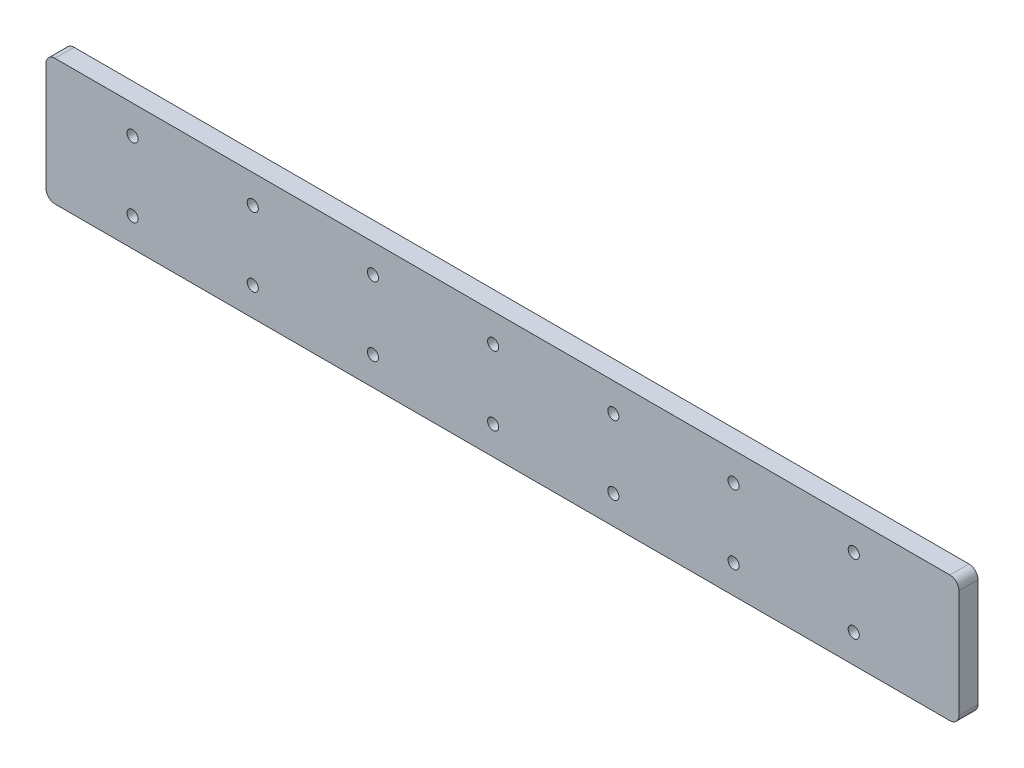
ISO-10303-21;
HEADER;
FILE_DESCRIPTION(('STEP AP214'),'2;1');
FILE_NAME('part.step','',(''),(''),'','','');
FILE_SCHEMA(('AUTOMOTIVE_DESIGN { 1 0 10303 214 1 1 1 1 }'));
ENDSEC;
DATA;
#1=APPLICATION_CONTEXT('core data for automotive mechanical design processes');
#2=APPLICATION_PROTOCOL_DEFINITION('international standard','automotive_design',2000,#1);
#3=PRODUCT_CONTEXT('',#1,'mechanical');
#4=PRODUCT('Part','Part','',(#3));
#5=PRODUCT_RELATED_PRODUCT_CATEGORY('part','',(#4));
#6=PRODUCT_DEFINITION_FORMATION('','',#4);
#7=PRODUCT_DEFINITION_CONTEXT('part definition',#1,'design');
#8=PRODUCT_DEFINITION('design','',#6,#7);
#9=PRODUCT_DEFINITION_SHAPE('','',#8);
#10=(LENGTH_UNIT() NAMED_UNIT(*) SI_UNIT(.MILLI.,.METRE.));
#11=(NAMED_UNIT(*) PLANE_ANGLE_UNIT() SI_UNIT($,.RADIAN.));
#12=(NAMED_UNIT(*) SI_UNIT($,.STERADIAN.) SOLID_ANGLE_UNIT());
#13=UNCERTAINTY_MEASURE_WITH_UNIT(LENGTH_MEASURE(1.E-05),#10,'distance_accuracy_value','');
#14=(GEOMETRIC_REPRESENTATION_CONTEXT(3) GLOBAL_UNCERTAINTY_ASSIGNED_CONTEXT((#13)) GLOBAL_UNIT_ASSIGNED_CONTEXT((#10,
#11,#12)) REPRESENTATION_CONTEXT('',''));
#15=CARTESIAN_POINT('',(0.,0.,0.));
#16=DIRECTION('',(0.,0.,1.));
#17=DIRECTION('',(1.,0.,0.));
#18=AXIS2_PLACEMENT_3D('',#15,#16,#17);
#19=CARTESIAN_POINT('',(0.,0.,6.35));
#20=DIRECTION('',(0.,0.,-1.));
#21=DIRECTION('',(-1.,0.,0.));
#22=AXIS2_PLACEMENT_3D('',#19,#20,#21);
#23=PLANE('',#22);
#24=CARTESIAN_POINT('',(-75.,-11.4999999999994,6.35));
#25=DIRECTION('',(0.,0.,1.));
#26=DIRECTION('',(-1.,0.,0.));
#27=AXIS2_PLACEMENT_3D('',#24,#25,#26);
#28=CIRCLE('',#27,1.84999999999999);
#29=CARTESIAN_POINT('',(-76.85,-11.4999999999994,6.35));
#30=VERTEX_POINT('',#29);
#31=EDGE_CURVE('E241',#30,#30,#28,.T.);
#32=ORIENTED_EDGE('',*,*,#31,.F.);
#33=EDGE_LOOP('',(#32));
#34=FACE_BOUND('',#33,.T.);
#35=CARTESIAN_POINT('',(-155.,-11.4999999999988,6.35));
#36=DIRECTION('',(0.,0.,1.));
#37=DIRECTION('',(-1.,0.,0.));
#38=AXIS2_PLACEMENT_3D('',#35,#36,#37);
#39=CIRCLE('',#38,1.85);
#40=CARTESIAN_POINT('',(-156.85,-11.4999999999988,6.35));
#41=VERTEX_POINT('',#40);
#42=EDGE_CURVE('E229',#41,#41,#39,.T.);
#43=ORIENTED_EDGE('',*,*,#42,.F.);
#44=EDGE_LOOP('',(#43));
#45=FACE_BOUND('',#44,.T.);
#46=CARTESIAN_POINT('',(-235.,-11.4999999999981,6.35));
#47=DIRECTION('',(0.,0.,1.));
#48=DIRECTION('',(-1.,0.,0.));
#49=AXIS2_PLACEMENT_3D('',#46,#47,#48);
#50=CIRCLE('',#49,1.85);
#51=CARTESIAN_POINT('',(-236.85,-11.4999999999981,6.35));
#52=VERTEX_POINT('',#51);
#53=EDGE_CURVE('E217',#52,#52,#50,.T.);
#54=ORIENTED_EDGE('',*,*,#53,.F.);
#55=EDGE_LOOP('',(#54));
#56=FACE_BOUND('',#55,.T.);
#57=CARTESIAN_POINT('',(-235.,11.4999999999983,6.35));
#58=DIRECTION('',(0.,0.,1.));
#59=DIRECTION('',(1.,0.,0.));
#60=AXIS2_PLACEMENT_3D('',#57,#58,#59);
#61=CIRCLE('',#60,1.85);
#62=CARTESIAN_POINT('',(-233.15,11.4999999999983,6.35));
#63=VERTEX_POINT('',#62);
#64=EDGE_CURVE('E205',#63,#63,#61,.T.);
#65=ORIENTED_EDGE('',*,*,#64,.F.);
#66=EDGE_LOOP('',(#65));
#67=FACE_BOUND('',#66,.T.);
#68=CARTESIAN_POINT('',(-155.,11.4999999999989,6.35));
#69=DIRECTION('',(0.,0.,1.));
#70=DIRECTION('',(1.,0.,0.));
#71=AXIS2_PLACEMENT_3D('',#68,#69,#70);
#72=CIRCLE('',#71,1.85);
#73=CARTESIAN_POINT('',(-153.15,11.4999999999989,6.35));
#74=VERTEX_POINT('',#73);
#75=EDGE_CURVE('E193',#74,#74,#72,.T.);
#76=ORIENTED_EDGE('',*,*,#75,.F.);
#77=EDGE_LOOP('',(#76));
#78=FACE_BOUND('',#77,.T.);
#79=CARTESIAN_POINT('',(-75.,11.4999999999994,6.35));
#80=DIRECTION('',(0.,0.,1.));
#81=DIRECTION('',(1.,0.,0.));
#82=AXIS2_PLACEMENT_3D('',#79,#80,#81);
#83=CIRCLE('',#82,1.84999999999999);
#84=CARTESIAN_POINT('',(-73.15,11.4999999999994,6.35));
#85=VERTEX_POINT('',#84);
#86=EDGE_CURVE('E181',#85,#85,#83,.T.);
#87=ORIENTED_EDGE('',*,*,#86,.F.);
#88=EDGE_LOOP('',(#87));
#89=FACE_BOUND('',#88,.T.);
#90=CARTESIAN_POINT('',(-275.,-11.4999999999978,6.35));
#91=DIRECTION('',(0.,0.,1.));
#92=DIRECTION('',(-1.,0.,0.));
#93=AXIS2_PLACEMENT_3D('',#90,#91,#92);
#94=CIRCLE('',#93,1.84999999999998);
#95=CARTESIAN_POINT('',(-276.85,-11.4999999999978,6.35));
#96=VERTEX_POINT('',#95);
#97=EDGE_CURVE('E164',#96,#96,#94,.T.);
#98=ORIENTED_EDGE('',*,*,#97,.F.);
#99=EDGE_LOOP('',(#98));
#100=FACE_BOUND('',#99,.T.);
#101=DIRECTION('',(0.,-1.,0.));
#102=VECTOR('',#101,1.);
#103=CARTESIAN_POINT('',(-303.8,21.,6.35));
#104=LINE('',#103,#102);
#105=CARTESIAN_POINT('',(-303.8,18.,6.35));
#106=VERTEX_POINT('',#105);
#107=CARTESIAN_POINT('',(-303.8,-18.,6.35));
#108=VERTEX_POINT('',#107);
#109=EDGE_CURVE('E171',#106,#108,#104,.T.);
#110=ORIENTED_EDGE('',*,*,#109,.T.);
#111=CARTESIAN_POINT('',(-300.8,-18.,6.35));
#112=DIRECTION('',(0.,0.,-1.));
#113=DIRECTION('',(-1.,0.,0.));
#114=AXIS2_PLACEMENT_3D('',#111,#112,#113);
#115=CIRCLE('',#114,3.);
#116=CARTESIAN_POINT('',(-300.8,-21.,6.35));
#117=VERTEX_POINT('',#116);
#118=EDGE_CURVE('E148',#108,#117,#115,.F.);
#119=ORIENTED_EDGE('',*,*,#118,.T.);
#120=DIRECTION('',(1.,0.,0.));
#121=VECTOR('',#120,1.);
#122=CARTESIAN_POINT('',(0.,-21.,6.35));
#123=LINE('',#122,#121);
#124=CARTESIAN_POINT('',(-2.99999999999999,-21.,6.35));
#125=VERTEX_POINT('',#124);
#126=EDGE_CURVE('E119',#117,#125,#123,.T.);
#127=ORIENTED_EDGE('',*,*,#126,.T.);
#128=CARTESIAN_POINT('',(-2.99999999999999,-18.,6.35));
#129=DIRECTION('',(0.,0.,-1.));
#130=DIRECTION('',(-1.,0.,0.));
#131=AXIS2_PLACEMENT_3D('',#128,#129,#130);
#132=CIRCLE('',#131,3.);
#133=CARTESIAN_POINT('',(0.,-18.,6.35));
#134=VERTEX_POINT('',#133);
#135=EDGE_CURVE('E146',#125,#134,#132,.F.);
#136=ORIENTED_EDGE('',*,*,#135,.T.);
#137=DIRECTION('',(0.,1.,0.));
#138=VECTOR('',#137,1.);
#139=CARTESIAN_POINT('',(0.,21.,6.35));
#140=LINE('',#139,#138);
#141=CARTESIAN_POINT('',(0.,18.,6.35));
#142=VERTEX_POINT('',#141);
#143=EDGE_CURVE('E126',#134,#142,#140,.T.);
#144=ORIENTED_EDGE('',*,*,#143,.T.);
#145=CARTESIAN_POINT('',(-2.99999999999999,18.,6.35));
#146=DIRECTION('',(0.,0.,-1.));
#147=DIRECTION('',(-1.,0.,0.));
#148=AXIS2_PLACEMENT_3D('',#145,#146,#147);
#149=CIRCLE('',#148,3.);
#150=CARTESIAN_POINT('',(-2.99999999999999,21.,6.35));
#151=VERTEX_POINT('',#150);
#152=EDGE_CURVE('E54',#142,#151,#149,.F.);
#153=ORIENTED_EDGE('',*,*,#152,.T.);
#154=DIRECTION('',(-1.,0.,0.));
#155=VECTOR('',#154,1.);
#156=CARTESIAN_POINT('',(0.,21.,6.35));
#157=LINE('',#156,#155);
#158=CARTESIAN_POINT('',(-300.8,21.,6.35));
#159=VERTEX_POINT('',#158);
#160=EDGE_CURVE('E129',#151,#159,#157,.T.);
#161=ORIENTED_EDGE('',*,*,#160,.T.);
#162=CARTESIAN_POINT('',(-300.8,18.,6.35));
#163=DIRECTION('',(0.,0.,-1.));
#164=DIRECTION('',(-1.,0.,0.));
#165=AXIS2_PLACEMENT_3D('',#162,#163,#164);
#166=CIRCLE('',#165,3.);
#167=EDGE_CURVE('E143',#159,#106,#166,.F.);
#168=ORIENTED_EDGE('',*,*,#167,.T.);
#169=EDGE_LOOP('',(#110,#119,#127,#136,#144,#153,#161,#168));
#170=FACE_BOUND('',#169,.T.);
#171=CARTESIAN_POINT('',(-35.,11.4999999999997,6.35));
#172=DIRECTION('',(0.,0.,1.));
#173=DIRECTION('',(1.,0.,0.));
#174=AXIS2_PLACEMENT_3D('',#171,#172,#173);
#175=CIRCLE('',#174,1.85);
#176=CARTESIAN_POINT('',(-33.15,11.4999999999997,6.35));
#177=VERTEX_POINT('',#176);
#178=EDGE_CURVE('E176',#177,#177,#175,.T.);
#179=ORIENTED_EDGE('',*,*,#178,.F.);
#180=EDGE_LOOP('',(#179));
#181=FACE_BOUND('',#180,.T.);
#182=CARTESIAN_POINT('',(-115.,11.4999999999992,6.35));
#183=DIRECTION('',(0.,0.,1.));
#184=DIRECTION('',(1.,0.,0.));
#185=AXIS2_PLACEMENT_3D('',#182,#183,#184);
#186=CIRCLE('',#185,1.84999999999999);
#187=CARTESIAN_POINT('',(-113.15,11.4999999999992,6.35));
#188=VERTEX_POINT('',#187);
#189=EDGE_CURVE('E187',#188,#188,#186,.T.);
#190=ORIENTED_EDGE('',*,*,#189,.F.);
#191=EDGE_LOOP('',(#190));
#192=FACE_BOUND('',#191,.T.);
#193=CARTESIAN_POINT('',(-195.,11.4999999999986,6.35));
#194=DIRECTION('',(0.,0.,1.));
#195=DIRECTION('',(1.,0.,0.));
#196=AXIS2_PLACEMENT_3D('',#193,#194,#195);
#197=CIRCLE('',#196,1.85);
#198=CARTESIAN_POINT('',(-193.15,11.4999999999986,6.35));
#199=VERTEX_POINT('',#198);
#200=EDGE_CURVE('E199',#199,#199,#197,.T.);
#201=ORIENTED_EDGE('',*,*,#200,.F.);
#202=EDGE_LOOP('',(#201));
#203=FACE_BOUND('',#202,.T.);
#204=CARTESIAN_POINT('',(-275.,11.499999999998,6.35));
#205=DIRECTION('',(0.,0.,1.));
#206=DIRECTION('',(1.,0.,0.));
#207=AXIS2_PLACEMENT_3D('',#204,#205,#206);
#208=CIRCLE('',#207,1.84999999999998);
#209=CARTESIAN_POINT('',(-273.15,11.499999999998,6.35));
#210=VERTEX_POINT('',#209);
#211=EDGE_CURVE('E211',#210,#210,#208,.T.);
#212=ORIENTED_EDGE('',*,*,#211,.F.);
#213=EDGE_LOOP('',(#212));
#214=FACE_BOUND('',#213,.T.);
#215=CARTESIAN_POINT('',(-195.,-11.4999999999985,6.35));
#216=DIRECTION('',(0.,0.,1.));
#217=DIRECTION('',(-1.,0.,0.));
#218=AXIS2_PLACEMENT_3D('',#215,#216,#217);
#219=CIRCLE('',#218,1.85);
#220=CARTESIAN_POINT('',(-196.85,-11.4999999999985,6.35));
#221=VERTEX_POINT('',#220);
#222=EDGE_CURVE('E223',#221,#221,#219,.T.);
#223=ORIENTED_EDGE('',*,*,#222,.F.);
#224=EDGE_LOOP('',(#223));
#225=FACE_BOUND('',#224,.T.);
#226=CARTESIAN_POINT('',(-115.,-11.4999999999991,6.35));
#227=DIRECTION('',(0.,0.,1.));
#228=DIRECTION('',(-1.,0.,0.));
#229=AXIS2_PLACEMENT_3D('',#226,#227,#228);
#230=CIRCLE('',#229,1.84999999999999);
#231=CARTESIAN_POINT('',(-116.85,-11.4999999999991,6.35));
#232=VERTEX_POINT('',#231);
#233=EDGE_CURVE('E235',#232,#232,#230,.T.);
#234=ORIENTED_EDGE('',*,*,#233,.F.);
#235=EDGE_LOOP('',(#234));
#236=FACE_BOUND('',#235,.T.);
#237=CARTESIAN_POINT('',(-35.,-11.4999999999997,6.35));
#238=DIRECTION('',(0.,0.,1.));
#239=DIRECTION('',(-1.,0.,0.));
#240=AXIS2_PLACEMENT_3D('',#237,#238,#239);
#241=CIRCLE('',#240,1.85);
#242=CARTESIAN_POINT('',(-36.85,-11.4999999999997,6.35));
#243=VERTEX_POINT('',#242);
#244=EDGE_CURVE('E247',#243,#243,#241,.T.);
#245=ORIENTED_EDGE('',*,*,#244,.F.);
#246=EDGE_LOOP('',(#245));
#247=FACE_BOUND('',#246,.T.);
#248=ADVANCED_FACE('F33',(#34,#45,#56,#67,#78,#89,#100,#170,#181,#192,#203,#214,#225,#236,#247),
#23,.F.);
#249=CARTESIAN_POINT('',(0.,0.,0.));
#250=DIRECTION('',(0.,0.,-1.));
#251=DIRECTION('',(-1.,0.,0.));
#252=AXIS2_PLACEMENT_3D('',#249,#250,#251);
#253=PLANE('',#252);
#254=CARTESIAN_POINT('',(-75.,-11.4999999999994,0.));
#255=DIRECTION('',(0.,0.,1.));
#256=DIRECTION('',(-1.,0.,0.));
#257=AXIS2_PLACEMENT_3D('',#254,#255,#256);
#258=CIRCLE('',#257,1.84999999999999);
#259=CARTESIAN_POINT('',(-76.85,-11.4999999999994,0.));
#260=VERTEX_POINT('',#259);
#261=EDGE_CURVE('E244',#260,#260,#258,.T.);
#262=ORIENTED_EDGE('',*,*,#261,.T.);
#263=EDGE_LOOP('',(#262));
#264=FACE_BOUND('',#263,.T.);
#265=CARTESIAN_POINT('',(-155.,-11.4999999999988,0.));
#266=DIRECTION('',(0.,0.,1.));
#267=DIRECTION('',(-1.,0.,0.));
#268=AXIS2_PLACEMENT_3D('',#265,#266,#267);
#269=CIRCLE('',#268,1.85);
#270=CARTESIAN_POINT('',(-156.85,-11.4999999999988,0.));
#271=VERTEX_POINT('',#270);
#272=EDGE_CURVE('E232',#271,#271,#269,.T.);
#273=ORIENTED_EDGE('',*,*,#272,.T.);
#274=EDGE_LOOP('',(#273));
#275=FACE_BOUND('',#274,.T.);
#276=CARTESIAN_POINT('',(-235.,-11.4999999999981,0.));
#277=DIRECTION('',(0.,0.,1.));
#278=DIRECTION('',(-1.,0.,0.));
#279=AXIS2_PLACEMENT_3D('',#276,#277,#278);
#280=CIRCLE('',#279,1.85);
#281=CARTESIAN_POINT('',(-236.85,-11.4999999999981,0.));
#282=VERTEX_POINT('',#281);
#283=EDGE_CURVE('E220',#282,#282,#280,.T.);
#284=ORIENTED_EDGE('',*,*,#283,.T.);
#285=EDGE_LOOP('',(#284));
#286=FACE_BOUND('',#285,.T.);
#287=CARTESIAN_POINT('',(-235.,11.4999999999983,0.));
#288=DIRECTION('',(0.,0.,1.));
#289=DIRECTION('',(1.,0.,0.));
#290=AXIS2_PLACEMENT_3D('',#287,#288,#289);
#291=CIRCLE('',#290,1.85);
#292=CARTESIAN_POINT('',(-233.15,11.4999999999983,0.));
#293=VERTEX_POINT('',#292);
#294=EDGE_CURVE('E208',#293,#293,#291,.T.);
#295=ORIENTED_EDGE('',*,*,#294,.T.);
#296=EDGE_LOOP('',(#295));
#297=FACE_BOUND('',#296,.T.);
#298=CARTESIAN_POINT('',(-155.,11.4999999999989,0.));
#299=DIRECTION('',(0.,0.,1.));
#300=DIRECTION('',(1.,0.,0.));
#301=AXIS2_PLACEMENT_3D('',#298,#299,#300);
#302=CIRCLE('',#301,1.85);
#303=CARTESIAN_POINT('',(-153.15,11.4999999999989,0.));
#304=VERTEX_POINT('',#303);
#305=EDGE_CURVE('E196',#304,#304,#302,.T.);
#306=ORIENTED_EDGE('',*,*,#305,.T.);
#307=EDGE_LOOP('',(#306));
#308=FACE_BOUND('',#307,.T.);
#309=CARTESIAN_POINT('',(-75.,11.4999999999994,0.));
#310=DIRECTION('',(0.,0.,1.));
#311=DIRECTION('',(1.,0.,0.));
#312=AXIS2_PLACEMENT_3D('',#309,#310,#311);
#313=CIRCLE('',#312,1.84999999999999);
#314=CARTESIAN_POINT('',(-73.15,11.4999999999994,0.));
#315=VERTEX_POINT('',#314);
#316=EDGE_CURVE('E184',#315,#315,#313,.T.);
#317=ORIENTED_EDGE('',*,*,#316,.T.);
#318=EDGE_LOOP('',(#317));
#319=FACE_BOUND('',#318,.T.);
#320=CARTESIAN_POINT('',(-275.,-11.4999999999978,0.));
#321=DIRECTION('',(0.,0.,1.));
#322=DIRECTION('',(-1.,0.,0.));
#323=AXIS2_PLACEMENT_3D('',#320,#321,#322);
#324=CIRCLE('',#323,1.84999999999998);
#325=CARTESIAN_POINT('',(-276.85,-11.4999999999978,0.));
#326=VERTEX_POINT('',#325);
#327=EDGE_CURVE('E167',#326,#326,#324,.T.);
#328=ORIENTED_EDGE('',*,*,#327,.T.);
#329=EDGE_LOOP('',(#328));
#330=FACE_BOUND('',#329,.T.);
#331=DIRECTION('',(1.,0.,0.));
#332=VECTOR('',#331,1.);
#333=CARTESIAN_POINT('',(0.,-21.,0.));
#334=LINE('',#333,#332);
#335=CARTESIAN_POINT('',(-300.8,-21.,0.));
#336=VERTEX_POINT('',#335);
#337=CARTESIAN_POINT('',(-2.99999999999999,-21.,0.));
#338=VERTEX_POINT('',#337);
#339=EDGE_CURVE('E116',#336,#338,#334,.T.);
#340=ORIENTED_EDGE('',*,*,#339,.F.);
#341=CARTESIAN_POINT('',(-300.8,-18.,0.));
#342=DIRECTION('',(0.,0.,-1.));
#343=DIRECTION('',(-1.,0.,0.));
#344=AXIS2_PLACEMENT_3D('',#341,#342,#343);
#345=CIRCLE('',#344,3.);
#346=CARTESIAN_POINT('',(-303.8,-18.,0.));
#347=VERTEX_POINT('',#346);
#348=EDGE_CURVE('E99',#336,#347,#345,.T.);
#349=ORIENTED_EDGE('',*,*,#348,.T.);
#350=DIRECTION('',(0.,-1.,0.));
#351=VECTOR('',#350,1.);
#352=CARTESIAN_POINT('',(-303.8,21.,0.));
#353=LINE('',#352,#351);
#354=CARTESIAN_POINT('',(-303.8,18.,0.));
#355=VERTEX_POINT('',#354);
#356=EDGE_CURVE('E127',#355,#347,#353,.T.);
#357=ORIENTED_EDGE('',*,*,#356,.F.);
#358=CARTESIAN_POINT('',(-300.8,18.,0.));
#359=DIRECTION('',(0.,0.,-1.));
#360=DIRECTION('',(-1.,0.,0.));
#361=AXIS2_PLACEMENT_3D('',#358,#359,#360);
#362=CIRCLE('',#361,3.);
#363=CARTESIAN_POINT('',(-300.8,21.,0.));
#364=VERTEX_POINT('',#363);
#365=EDGE_CURVE('E120',#355,#364,#362,.T.);
#366=ORIENTED_EDGE('',*,*,#365,.T.);
#367=DIRECTION('',(-1.,0.,0.));
#368=VECTOR('',#367,1.);
#369=CARTESIAN_POINT('',(0.,21.,0.));
#370=LINE('',#369,#368);
#371=CARTESIAN_POINT('',(-2.99999999999999,21.,0.));
#372=VERTEX_POINT('',#371);
#373=EDGE_CURVE('E131',#372,#364,#370,.T.);
#374=ORIENTED_EDGE('',*,*,#373,.F.);
#375=CARTESIAN_POINT('',(-2.99999999999999,18.,0.));
#376=DIRECTION('',(0.,0.,-1.));
#377=DIRECTION('',(-1.,0.,0.));
#378=AXIS2_PLACEMENT_3D('',#375,#376,#377);
#379=CIRCLE('',#378,3.);
#380=CARTESIAN_POINT('',(0.,18.,0.));
#381=VERTEX_POINT('',#380);
#382=EDGE_CURVE('E137',#372,#381,#379,.T.);
#383=ORIENTED_EDGE('',*,*,#382,.T.);
#384=DIRECTION('',(0.,1.,0.));
#385=VECTOR('',#384,1.);
#386=CARTESIAN_POINT('',(0.,21.,0.));
#387=LINE('',#386,#385);
#388=CARTESIAN_POINT('',(0.,-18.,0.));
#389=VERTEX_POINT('',#388);
#390=EDGE_CURVE('E159',#389,#381,#387,.T.);
#391=ORIENTED_EDGE('',*,*,#390,.F.);
#392=CARTESIAN_POINT('',(-2.99999999999999,-18.,0.));
#393=DIRECTION('',(0.,0.,-1.));
#394=DIRECTION('',(-1.,0.,0.));
#395=AXIS2_PLACEMENT_3D('',#392,#393,#394);
#396=CIRCLE('',#395,3.);
#397=EDGE_CURVE('E110',#389,#338,#396,.T.);
#398=ORIENTED_EDGE('',*,*,#397,.T.);
#399=EDGE_LOOP('',(#340,#349,#357,#366,#374,#383,#391,#398));
#400=FACE_BOUND('',#399,.T.);
#401=CARTESIAN_POINT('',(-35.,11.4999999999997,0.));
#402=DIRECTION('',(0.,0.,1.));
#403=DIRECTION('',(1.,0.,0.));
#404=AXIS2_PLACEMENT_3D('',#401,#402,#403);
#405=CIRCLE('',#404,1.85);
#406=CARTESIAN_POINT('',(-33.15,11.4999999999997,0.));
#407=VERTEX_POINT('',#406);
#408=EDGE_CURVE('E178',#407,#407,#405,.T.);
#409=ORIENTED_EDGE('',*,*,#408,.T.);
#410=EDGE_LOOP('',(#409));
#411=FACE_BOUND('',#410,.T.);
#412=CARTESIAN_POINT('',(-115.,11.4999999999992,0.));
#413=DIRECTION('',(0.,0.,1.));
#414=DIRECTION('',(1.,0.,0.));
#415=AXIS2_PLACEMENT_3D('',#412,#413,#414);
#416=CIRCLE('',#415,1.84999999999999);
#417=CARTESIAN_POINT('',(-113.15,11.4999999999992,0.));
#418=VERTEX_POINT('',#417);
#419=EDGE_CURVE('E190',#418,#418,#416,.T.);
#420=ORIENTED_EDGE('',*,*,#419,.T.);
#421=EDGE_LOOP('',(#420));
#422=FACE_BOUND('',#421,.T.);
#423=CARTESIAN_POINT('',(-195.,11.4999999999986,0.));
#424=DIRECTION('',(0.,0.,1.));
#425=DIRECTION('',(1.,0.,0.));
#426=AXIS2_PLACEMENT_3D('',#423,#424,#425);
#427=CIRCLE('',#426,1.85);
#428=CARTESIAN_POINT('',(-193.15,11.4999999999986,0.));
#429=VERTEX_POINT('',#428);
#430=EDGE_CURVE('E202',#429,#429,#427,.T.);
#431=ORIENTED_EDGE('',*,*,#430,.T.);
#432=EDGE_LOOP('',(#431));
#433=FACE_BOUND('',#432,.T.);
#434=CARTESIAN_POINT('',(-275.,11.499999999998,0.));
#435=DIRECTION('',(0.,0.,1.));
#436=DIRECTION('',(1.,0.,0.));
#437=AXIS2_PLACEMENT_3D('',#434,#435,#436);
#438=CIRCLE('',#437,1.84999999999998);
#439=CARTESIAN_POINT('',(-273.15,11.499999999998,0.));
#440=VERTEX_POINT('',#439);
#441=EDGE_CURVE('E214',#440,#440,#438,.T.);
#442=ORIENTED_EDGE('',*,*,#441,.T.);
#443=EDGE_LOOP('',(#442));
#444=FACE_BOUND('',#443,.T.);
#445=CARTESIAN_POINT('',(-195.,-11.4999999999985,0.));
#446=DIRECTION('',(0.,0.,1.));
#447=DIRECTION('',(-1.,0.,0.));
#448=AXIS2_PLACEMENT_3D('',#445,#446,#447);
#449=CIRCLE('',#448,1.85);
#450=CARTESIAN_POINT('',(-196.85,-11.4999999999985,0.));
#451=VERTEX_POINT('',#450);
#452=EDGE_CURVE('E226',#451,#451,#449,.T.);
#453=ORIENTED_EDGE('',*,*,#452,.T.);
#454=EDGE_LOOP('',(#453));
#455=FACE_BOUND('',#454,.T.);
#456=CARTESIAN_POINT('',(-115.,-11.4999999999991,0.));
#457=DIRECTION('',(0.,0.,1.));
#458=DIRECTION('',(-1.,0.,0.));
#459=AXIS2_PLACEMENT_3D('',#456,#457,#458);
#460=CIRCLE('',#459,1.84999999999999);
#461=CARTESIAN_POINT('',(-116.85,-11.4999999999991,0.));
#462=VERTEX_POINT('',#461);
#463=EDGE_CURVE('E238',#462,#462,#460,.T.);
#464=ORIENTED_EDGE('',*,*,#463,.T.);
#465=EDGE_LOOP('',(#464));
#466=FACE_BOUND('',#465,.T.);
#467=CARTESIAN_POINT('',(-35.,-11.4999999999997,0.));
#468=DIRECTION('',(0.,0.,1.));
#469=DIRECTION('',(-1.,0.,0.));
#470=AXIS2_PLACEMENT_3D('',#467,#468,#469);
#471=CIRCLE('',#470,1.85);
#472=CARTESIAN_POINT('',(-36.85,-11.4999999999997,0.));
#473=VERTEX_POINT('',#472);
#474=EDGE_CURVE('E250',#473,#473,#471,.T.);
#475=ORIENTED_EDGE('',*,*,#474,.T.);
#476=EDGE_LOOP('',(#475));
#477=FACE_BOUND('',#476,.T.);
#478=ADVANCED_FACE('F123',(#264,#275,#286,#297,#308,#319,#330,#400,#411,#422,#433,#444,#455,
#466,#477),#253,.T.);
#479=CARTESIAN_POINT('',(0.,21.,6.35));
#480=DIRECTION('',(-1.,0.,0.));
#481=DIRECTION('',(0.,0.,1.));
#482=AXIS2_PLACEMENT_3D('',#479,#480,#481);
#483=PLANE('',#482);
#484=ORIENTED_EDGE('',*,*,#143,.F.);
#485=DIRECTION('',(0.,0.,-1.));
#486=VECTOR('',#485,1.);
#487=CARTESIAN_POINT('',(0.,-18.,6.35));
#488=LINE('',#487,#486);
#489=EDGE_CURVE('E152',#134,#389,#488,.T.);
#490=ORIENTED_EDGE('',*,*,#489,.T.);
#491=ORIENTED_EDGE('',*,*,#390,.T.);
#492=DIRECTION('',(0.,0.,-1.));
#493=VECTOR('',#492,1.);
#494=CARTESIAN_POINT('',(0.,18.,6.35));
#495=LINE('',#494,#493);
#496=EDGE_CURVE('E150',#381,#142,#495,.F.);
#497=ORIENTED_EDGE('',*,*,#496,.T.);
#498=EDGE_LOOP('',(#484,#490,#491,#497));
#499=FACE_BOUND('',#498,.T.);
#500=ADVANCED_FACE('F158',(#499),#483,.F.);
#501=CARTESIAN_POINT('',(0.,21.,6.35));
#502=DIRECTION('',(0.,-1.,0.));
#503=DIRECTION('',(1.,0.,0.));
#504=AXIS2_PLACEMENT_3D('',#501,#502,#503);
#505=PLANE('',#504);
#506=ORIENTED_EDGE('',*,*,#160,.F.);
#507=DIRECTION('',(0.,0.,-1.));
#508=VECTOR('',#507,1.);
#509=CARTESIAN_POINT('',(-2.99999999999999,21.,6.35));
#510=LINE('',#509,#508);
#511=EDGE_CURVE('E11',#151,#372,#510,.T.);
#512=ORIENTED_EDGE('',*,*,#511,.T.);
#513=ORIENTED_EDGE('',*,*,#373,.T.);
#514=DIRECTION('',(0.,0.,-1.));
#515=VECTOR('',#514,1.);
#516=CARTESIAN_POINT('',(-300.8,21.,6.35));
#517=LINE('',#516,#515);
#518=EDGE_CURVE('E41',#364,#159,#517,.F.);
#519=ORIENTED_EDGE('',*,*,#518,.T.);
#520=EDGE_LOOP('',(#506,#512,#513,#519));
#521=FACE_BOUND('',#520,.T.);
#522=ADVANCED_FACE('F278',(#521),#505,.F.);
#523=CARTESIAN_POINT('',(-303.8,21.,6.35));
#524=DIRECTION('',(1.,0.,0.));
#525=DIRECTION('',(0.,0.,-1.));
#526=AXIS2_PLACEMENT_3D('',#523,#524,#525);
#527=PLANE('',#526);
#528=ORIENTED_EDGE('',*,*,#356,.T.);
#529=DIRECTION('',(0.,0.,-1.));
#530=VECTOR('',#529,1.);
#531=CARTESIAN_POINT('',(-303.8,-18.,6.35));
#532=LINE('',#531,#530);
#533=EDGE_CURVE('E104',#347,#108,#532,.F.);
#534=ORIENTED_EDGE('',*,*,#533,.T.);
#535=ORIENTED_EDGE('',*,*,#109,.F.);
#536=DIRECTION('',(0.,0.,-1.));
#537=VECTOR('',#536,1.);
#538=CARTESIAN_POINT('',(-303.8,18.,6.35));
#539=LINE('',#538,#537);
#540=EDGE_CURVE('E109',#106,#355,#539,.T.);
#541=ORIENTED_EDGE('',*,*,#540,.T.);
#542=EDGE_LOOP('',(#528,#534,#535,#541));
#543=FACE_BOUND('',#542,.T.);
#544=ADVANCED_FACE('F275',(#543),#527,.F.);
#545=CARTESIAN_POINT('',(0.,-21.,6.35));
#546=DIRECTION('',(0.,1.,0.));
#547=DIRECTION('',(-1.,0.,0.));
#548=AXIS2_PLACEMENT_3D('',#545,#546,#547);
#549=PLANE('',#548);
#550=ORIENTED_EDGE('',*,*,#126,.F.);
#551=DIRECTION('',(0.,0.,-1.));
#552=VECTOR('',#551,1.);
#553=CARTESIAN_POINT('',(-300.8,-21.,6.35));
#554=LINE('',#553,#552);
#555=EDGE_CURVE('E103',#117,#336,#554,.T.);
#556=ORIENTED_EDGE('',*,*,#555,.T.);
#557=ORIENTED_EDGE('',*,*,#339,.T.);
#558=DIRECTION('',(0.,0.,-1.));
#559=VECTOR('',#558,1.);
#560=CARTESIAN_POINT('',(-2.99999999999999,-21.,6.35));
#561=LINE('',#560,#559);
#562=EDGE_CURVE('E121',#338,#125,#561,.F.);
#563=ORIENTED_EDGE('',*,*,#562,.T.);
#564=EDGE_LOOP('',(#550,#556,#557,#563));
#565=FACE_BOUND('',#564,.T.);
#566=ADVANCED_FACE('F115',(#565),#549,.F.);
#567=CARTESIAN_POINT('',(-275.,-11.4999999999978,6.35));
#568=DIRECTION('',(0.,0.,-1.));
#569=DIRECTION('',(-1.,0.,0.));
#570=AXIS2_PLACEMENT_3D('',#567,#568,#569);
#571=CYLINDRICAL_SURFACE('',#570,1.84999999999998);
#572=ORIENTED_EDGE('',*,*,#97,.T.);
#573=EDGE_LOOP('',(#572));
#574=FACE_BOUND('',#573,.T.);
#575=ORIENTED_EDGE('',*,*,#327,.F.);
#576=EDGE_LOOP('',(#575));
#577=FACE_BOUND('',#576,.T.);
#578=ADVANCED_FACE('F270',(#574,#577),#571,.F.);
#579=CARTESIAN_POINT('',(-35.,11.4999999999997,6.35));
#580=DIRECTION('',(0.,0.,-1.));
#581=DIRECTION('',(-1.,0.,0.));
#582=AXIS2_PLACEMENT_3D('',#579,#580,#581);
#583=CYLINDRICAL_SURFACE('',#582,1.85);
#584=ORIENTED_EDGE('',*,*,#178,.T.);
#585=EDGE_LOOP('',(#584));
#586=FACE_BOUND('',#585,.T.);
#587=ORIENTED_EDGE('',*,*,#408,.F.);
#588=EDGE_LOOP('',(#587));
#589=FACE_BOUND('',#588,.T.);
#590=ADVANCED_FACE('F363',(#586,#589),#583,.F.);
#591=CARTESIAN_POINT('',(-75.,11.4999999999994,6.35));
#592=DIRECTION('',(0.,0.,-1.));
#593=DIRECTION('',(-1.,0.,0.));
#594=AXIS2_PLACEMENT_3D('',#591,#592,#593);
#595=CYLINDRICAL_SURFACE('',#594,1.84999999999999);
#596=ORIENTED_EDGE('',*,*,#86,.T.);
#597=EDGE_LOOP('',(#596));
#598=FACE_BOUND('',#597,.T.);
#599=ORIENTED_EDGE('',*,*,#316,.F.);
#600=EDGE_LOOP('',(#599));
#601=FACE_BOUND('',#600,.T.);
#602=ADVANCED_FACE('F360',(#598,#601),#595,.F.);
#603=CARTESIAN_POINT('',(-115.,11.4999999999992,6.35));
#604=DIRECTION('',(0.,0.,-1.));
#605=DIRECTION('',(-1.,0.,0.));
#606=AXIS2_PLACEMENT_3D('',#603,#604,#605);
#607=CYLINDRICAL_SURFACE('',#606,1.84999999999999);
#608=ORIENTED_EDGE('',*,*,#189,.T.);
#609=EDGE_LOOP('',(#608));
#610=FACE_BOUND('',#609,.T.);
#611=ORIENTED_EDGE('',*,*,#419,.F.);
#612=EDGE_LOOP('',(#611));
#613=FACE_BOUND('',#612,.T.);
#614=ADVANCED_FACE('F356',(#610,#613),#607,.F.);
#615=CARTESIAN_POINT('',(-155.,11.4999999999989,6.35));
#616=DIRECTION('',(0.,0.,-1.));
#617=DIRECTION('',(-1.,0.,0.));
#618=AXIS2_PLACEMENT_3D('',#615,#616,#617);
#619=CYLINDRICAL_SURFACE('',#618,1.85);
#620=ORIENTED_EDGE('',*,*,#75,.T.);
#621=EDGE_LOOP('',(#620));
#622=FACE_BOUND('',#621,.T.);
#623=ORIENTED_EDGE('',*,*,#305,.F.);
#624=EDGE_LOOP('',(#623));
#625=FACE_BOUND('',#624,.T.);
#626=ADVANCED_FACE('F352',(#622,#625),#619,.F.);
#627=CARTESIAN_POINT('',(-195.,11.4999999999986,6.35));
#628=DIRECTION('',(0.,0.,-1.));
#629=DIRECTION('',(-1.,0.,0.));
#630=AXIS2_PLACEMENT_3D('',#627,#628,#629);
#631=CYLINDRICAL_SURFACE('',#630,1.85);
#632=ORIENTED_EDGE('',*,*,#200,.T.);
#633=EDGE_LOOP('',(#632));
#634=FACE_BOUND('',#633,.T.);
#635=ORIENTED_EDGE('',*,*,#430,.F.);
#636=EDGE_LOOP('',(#635));
#637=FACE_BOUND('',#636,.T.);
#638=ADVANCED_FACE('F348',(#634,#637),#631,.F.);
#639=CARTESIAN_POINT('',(-235.,11.4999999999983,6.35));
#640=DIRECTION('',(0.,0.,-1.));
#641=DIRECTION('',(-1.,0.,0.));
#642=AXIS2_PLACEMENT_3D('',#639,#640,#641);
#643=CYLINDRICAL_SURFACE('',#642,1.85);
#644=ORIENTED_EDGE('',*,*,#64,.T.);
#645=EDGE_LOOP('',(#644));
#646=FACE_BOUND('',#645,.T.);
#647=ORIENTED_EDGE('',*,*,#294,.F.);
#648=EDGE_LOOP('',(#647));
#649=FACE_BOUND('',#648,.T.);
#650=ADVANCED_FACE('F344',(#646,#649),#643,.F.);
#651=CARTESIAN_POINT('',(-275.,11.499999999998,6.35));
#652=DIRECTION('',(0.,0.,-1.));
#653=DIRECTION('',(-1.,0.,0.));
#654=AXIS2_PLACEMENT_3D('',#651,#652,#653);
#655=CYLINDRICAL_SURFACE('',#654,1.84999999999998);
#656=ORIENTED_EDGE('',*,*,#211,.T.);
#657=EDGE_LOOP('',(#656));
#658=FACE_BOUND('',#657,.T.);
#659=ORIENTED_EDGE('',*,*,#441,.F.);
#660=EDGE_LOOP('',(#659));
#661=FACE_BOUND('',#660,.T.);
#662=ADVANCED_FACE('F340',(#658,#661),#655,.F.);
#663=CARTESIAN_POINT('',(-235.,-11.4999999999981,6.35));
#664=DIRECTION('',(0.,0.,-1.));
#665=DIRECTION('',(-1.,0.,0.));
#666=AXIS2_PLACEMENT_3D('',#663,#664,#665);
#667=CYLINDRICAL_SURFACE('',#666,1.85);
#668=ORIENTED_EDGE('',*,*,#53,.T.);
#669=EDGE_LOOP('',(#668));
#670=FACE_BOUND('',#669,.T.);
#671=ORIENTED_EDGE('',*,*,#283,.F.);
#672=EDGE_LOOP('',(#671));
#673=FACE_BOUND('',#672,.T.);
#674=ADVANCED_FACE('F336',(#670,#673),#667,.F.);
#675=CARTESIAN_POINT('',(-195.,-11.4999999999985,6.35));
#676=DIRECTION('',(0.,0.,-1.));
#677=DIRECTION('',(-1.,0.,0.));
#678=AXIS2_PLACEMENT_3D('',#675,#676,#677);
#679=CYLINDRICAL_SURFACE('',#678,1.85);
#680=ORIENTED_EDGE('',*,*,#222,.T.);
#681=EDGE_LOOP('',(#680));
#682=FACE_BOUND('',#681,.T.);
#683=ORIENTED_EDGE('',*,*,#452,.F.);
#684=EDGE_LOOP('',(#683));
#685=FACE_BOUND('',#684,.T.);
#686=ADVANCED_FACE('F332',(#682,#685),#679,.F.);
#687=CARTESIAN_POINT('',(-155.,-11.4999999999988,6.35));
#688=DIRECTION('',(0.,0.,-1.));
#689=DIRECTION('',(-1.,0.,0.));
#690=AXIS2_PLACEMENT_3D('',#687,#688,#689);
#691=CYLINDRICAL_SURFACE('',#690,1.85);
#692=ORIENTED_EDGE('',*,*,#42,.T.);
#693=EDGE_LOOP('',(#692));
#694=FACE_BOUND('',#693,.T.);
#695=ORIENTED_EDGE('',*,*,#272,.F.);
#696=EDGE_LOOP('',(#695));
#697=FACE_BOUND('',#696,.T.);
#698=ADVANCED_FACE('F316',(#694,#697),#691,.F.);
#699=CARTESIAN_POINT('',(-115.,-11.4999999999991,6.35));
#700=DIRECTION('',(0.,0.,-1.));
#701=DIRECTION('',(-1.,0.,0.));
#702=AXIS2_PLACEMENT_3D('',#699,#700,#701);
#703=CYLINDRICAL_SURFACE('',#702,1.84999999999999);
#704=ORIENTED_EDGE('',*,*,#233,.T.);
#705=EDGE_LOOP('',(#704));
#706=FACE_BOUND('',#705,.T.);
#707=ORIENTED_EDGE('',*,*,#463,.F.);
#708=EDGE_LOOP('',(#707));
#709=FACE_BOUND('',#708,.T.);
#710=ADVANCED_FACE('F312',(#706,#709),#703,.F.);
#711=CARTESIAN_POINT('',(-75.,-11.4999999999994,6.35));
#712=DIRECTION('',(0.,0.,-1.));
#713=DIRECTION('',(-1.,0.,0.));
#714=AXIS2_PLACEMENT_3D('',#711,#712,#713);
#715=CYLINDRICAL_SURFACE('',#714,1.84999999999999);
#716=ORIENTED_EDGE('',*,*,#31,.T.);
#717=EDGE_LOOP('',(#716));
#718=FACE_BOUND('',#717,.T.);
#719=ORIENTED_EDGE('',*,*,#261,.F.);
#720=EDGE_LOOP('',(#719));
#721=FACE_BOUND('',#720,.T.);
#722=ADVANCED_FACE('F315',(#718,#721),#715,.F.);
#723=CARTESIAN_POINT('',(-35.,-11.4999999999997,6.35));
#724=DIRECTION('',(0.,0.,-1.));
#725=DIRECTION('',(-1.,0.,0.));
#726=AXIS2_PLACEMENT_3D('',#723,#724,#725);
#727=CYLINDRICAL_SURFACE('',#726,1.85);
#728=ORIENTED_EDGE('',*,*,#244,.T.);
#729=EDGE_LOOP('',(#728));
#730=FACE_BOUND('',#729,.T.);
#731=ORIENTED_EDGE('',*,*,#474,.F.);
#732=EDGE_LOOP('',(#731));
#733=FACE_BOUND('',#732,.T.);
#734=ADVANCED_FACE('F256',(#730,#733),#727,.F.);
#735=CARTESIAN_POINT('',(-300.8,-18.,6.35));
#736=DIRECTION('',(0.,0.,-1.));
#737=DIRECTION('',(-1.,0.,0.));
#738=AXIS2_PLACEMENT_3D('',#735,#736,#737);
#739=CYLINDRICAL_SURFACE('',#738,3.);
#740=ORIENTED_EDGE('',*,*,#118,.F.);
#741=ORIENTED_EDGE('',*,*,#533,.F.);
#742=ORIENTED_EDGE('',*,*,#348,.F.);
#743=ORIENTED_EDGE('',*,*,#555,.F.);
#744=EDGE_LOOP('',(#740,#741,#742,#743));
#745=FACE_BOUND('',#744,.T.);
#746=ADVANCED_FACE('F102',(#745),#739,.T.);
#747=CARTESIAN_POINT('',(-2.99999999999999,-18.,6.35));
#748=DIRECTION('',(0.,0.,-1.));
#749=DIRECTION('',(-1.,0.,0.));
#750=AXIS2_PLACEMENT_3D('',#747,#748,#749);
#751=CYLINDRICAL_SURFACE('',#750,3.);
#752=ORIENTED_EDGE('',*,*,#135,.F.);
#753=ORIENTED_EDGE('',*,*,#562,.F.);
#754=ORIENTED_EDGE('',*,*,#397,.F.);
#755=ORIENTED_EDGE('',*,*,#489,.F.);
#756=EDGE_LOOP('',(#752,#753,#754,#755));
#757=FACE_BOUND('',#756,.T.);
#758=ADVANCED_FACE('F286',(#757),#751,.T.);
#759=CARTESIAN_POINT('',(-2.99999999999999,18.,6.35));
#760=DIRECTION('',(0.,0.,-1.));
#761=DIRECTION('',(-1.,0.,0.));
#762=AXIS2_PLACEMENT_3D('',#759,#760,#761);
#763=CYLINDRICAL_SURFACE('',#762,3.);
#764=ORIENTED_EDGE('',*,*,#152,.F.);
#765=ORIENTED_EDGE('',*,*,#496,.F.);
#766=ORIENTED_EDGE('',*,*,#382,.F.);
#767=ORIENTED_EDGE('',*,*,#511,.F.);
#768=EDGE_LOOP('',(#764,#765,#766,#767));
#769=FACE_BOUND('',#768,.T.);
#770=ADVANCED_FACE('F288',(#769),#763,.T.);
#771=CARTESIAN_POINT('',(-300.8,18.,6.35));
#772=DIRECTION('',(0.,0.,-1.));
#773=DIRECTION('',(-1.,0.,0.));
#774=AXIS2_PLACEMENT_3D('',#771,#772,#773);
#775=CYLINDRICAL_SURFACE('',#774,3.);
#776=ORIENTED_EDGE('',*,*,#167,.F.);
#777=ORIENTED_EDGE('',*,*,#518,.F.);
#778=ORIENTED_EDGE('',*,*,#365,.F.);
#779=ORIENTED_EDGE('',*,*,#540,.F.);
#780=EDGE_LOOP('',(#776,#777,#778,#779));
#781=FACE_BOUND('',#780,.T.);
#782=ADVANCED_FACE('F35',(#781),#775,.T.);
#783=CLOSED_SHELL('',(#248,#478,#500,#522,#544,#566,#578,#590,#602,#614,#626,#638,#650,#662,
#674,#686,#698,#710,#722,#734,#746,#758,#770,#782));
#784=MANIFOLD_SOLID_BREP('B2',#783);
#785=ADVANCED_BREP_SHAPE_REPRESENTATION('',(#18,#784),#14);
#786=SHAPE_DEFINITION_REPRESENTATION(#9,#785);
ENDSEC;
END-ISO-10303-21;
